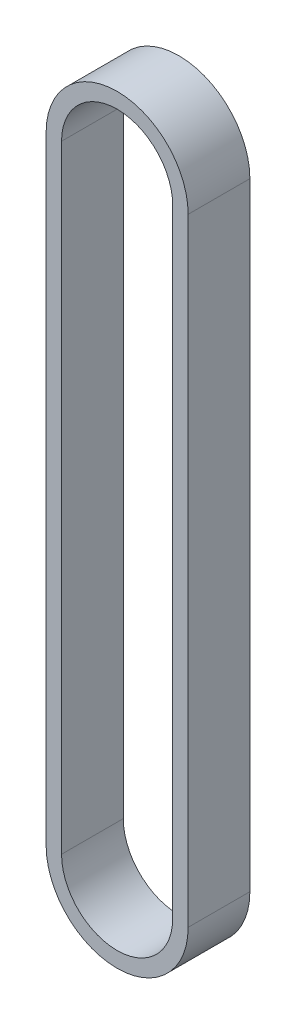
ISO-10303-21;
HEADER;
FILE_DESCRIPTION(('STEP AP214'),'2;1');
FILE_NAME('part.step','',(''),(''),'','','');
FILE_SCHEMA(('AUTOMOTIVE_DESIGN { 1 0 10303 214 1 1 1 1 }'));
ENDSEC;
DATA;
#1=APPLICATION_CONTEXT('core data for automotive mechanical design processes');
#2=APPLICATION_PROTOCOL_DEFINITION('international standard','automotive_design',2000,#1);
#3=PRODUCT_CONTEXT('',#1,'mechanical');
#4=PRODUCT('Part','Part','',(#3));
#5=PRODUCT_RELATED_PRODUCT_CATEGORY('part','',(#4));
#6=PRODUCT_DEFINITION_FORMATION('','',#4);
#7=PRODUCT_DEFINITION_CONTEXT('part definition',#1,'design');
#8=PRODUCT_DEFINITION('design','',#6,#7);
#9=PRODUCT_DEFINITION_SHAPE('','',#8);
#10=(LENGTH_UNIT() NAMED_UNIT(*) SI_UNIT(.MILLI.,.METRE.));
#11=(NAMED_UNIT(*) PLANE_ANGLE_UNIT() SI_UNIT($,.RADIAN.));
#12=(NAMED_UNIT(*) SI_UNIT($,.STERADIAN.) SOLID_ANGLE_UNIT());
#13=UNCERTAINTY_MEASURE_WITH_UNIT(LENGTH_MEASURE(1.E-05),#10,'distance_accuracy_value','');
#14=(GEOMETRIC_REPRESENTATION_CONTEXT(3) GLOBAL_UNCERTAINTY_ASSIGNED_CONTEXT((#13)) GLOBAL_UNIT_ASSIGNED_CONTEXT((#10,
#11,#12)) REPRESENTATION_CONTEXT('',''));
#15=CARTESIAN_POINT('',(0.,0.,0.));
#16=DIRECTION('',(0.,0.,1.));
#17=DIRECTION('',(1.,0.,0.));
#18=AXIS2_PLACEMENT_3D('',#15,#16,#17);
#19=CARTESIAN_POINT('',(0.,30.,3.));
#20=DIRECTION('',(0.,0.,1.));
#21=DIRECTION('',(1.,0.,0.));
#22=AXIS2_PLACEMENT_3D('',#19,#20,#21);
#23=PLANE('',#22);
#24=CARTESIAN_POINT('',(0.,30.,3.));
#25=DIRECTION('',(0.,0.,1.));
#26=DIRECTION('',(1.,0.,0.));
#27=AXIS2_PLACEMENT_3D('',#24,#25,#26);
#28=CIRCLE('',#27,6.9);
#29=CARTESIAN_POINT('',(6.9,30.,3.));
#30=VERTEX_POINT('',#29);
#31=CARTESIAN_POINT('',(-6.9,30.,3.));
#32=VERTEX_POINT('',#31);
#33=EDGE_CURVE('E118',#30,#32,#28,.T.);
#34=ORIENTED_EDGE('',*,*,#33,.T.);
#35=DIRECTION('',(0.,-1.,0.));
#36=VECTOR('',#35,1.);
#37=CARTESIAN_POINT('',(-6.9,30.,3.));
#38=LINE('',#37,#36);
#39=CARTESIAN_POINT('',(-6.9,-30.,3.));
#40=VERTEX_POINT('',#39);
#41=EDGE_CURVE('E121',#32,#40,#38,.T.);
#42=ORIENTED_EDGE('',*,*,#41,.T.);
#43=CARTESIAN_POINT('',(0.,-30.,3.));
#44=DIRECTION('',(0.,0.,1.));
#45=DIRECTION('',(1.,0.,0.));
#46=AXIS2_PLACEMENT_3D('',#43,#44,#45);
#47=CIRCLE('',#46,6.9);
#48=CARTESIAN_POINT('',(6.9,-30.,3.));
#49=VERTEX_POINT('',#48);
#50=EDGE_CURVE('E124',#40,#49,#47,.T.);
#51=ORIENTED_EDGE('',*,*,#50,.T.);
#52=DIRECTION('',(0.,1.,0.));
#53=VECTOR('',#52,1.);
#54=CARTESIAN_POINT('',(6.9,30.,3.));
#55=LINE('',#54,#53);
#56=EDGE_CURVE('E126',#49,#30,#55,.T.);
#57=ORIENTED_EDGE('',*,*,#56,.T.);
#58=EDGE_LOOP('',(#34,#42,#51,#57));
#59=FACE_BOUND('',#58,.T.);
#60=DIRECTION('',(0.,-1.,0.));
#61=VECTOR('',#60,1.);
#62=CARTESIAN_POINT('',(-5.4,30.,3.));
#63=LINE('',#62,#61);
#64=CARTESIAN_POINT('',(-5.4,30.,3.));
#65=VERTEX_POINT('',#64);
#66=CARTESIAN_POINT('',(-5.4,-30.,3.));
#67=VERTEX_POINT('',#66);
#68=EDGE_CURVE('E90',#65,#67,#63,.T.);
#69=ORIENTED_EDGE('',*,*,#68,.F.);
#70=CARTESIAN_POINT('',(0.,30.,3.));
#71=DIRECTION('',(0.,0.,1.));
#72=DIRECTION('',(1.,0.,0.));
#73=AXIS2_PLACEMENT_3D('',#70,#71,#72);
#74=CIRCLE('',#73,5.4);
#75=CARTESIAN_POINT('',(5.4,30.,3.));
#76=VERTEX_POINT('',#75);
#77=EDGE_CURVE('E82',#76,#65,#74,.T.);
#78=ORIENTED_EDGE('',*,*,#77,.F.);
#79=DIRECTION('',(0.,1.,0.));
#80=VECTOR('',#79,1.);
#81=CARTESIAN_POINT('',(5.4,30.,3.));
#82=LINE('',#81,#80);
#83=CARTESIAN_POINT('',(5.4,-30.,3.));
#84=VERTEX_POINT('',#83);
#85=EDGE_CURVE('E104',#84,#76,#82,.T.);
#86=ORIENTED_EDGE('',*,*,#85,.F.);
#87=CARTESIAN_POINT('',(0.,-30.,3.));
#88=DIRECTION('',(0.,0.,1.));
#89=DIRECTION('',(1.,0.,0.));
#90=AXIS2_PLACEMENT_3D('',#87,#88,#89);
#91=CIRCLE('',#90,5.4);
#92=EDGE_CURVE('E102',#67,#84,#91,.T.);
#93=ORIENTED_EDGE('',*,*,#92,.F.);
#94=EDGE_LOOP('',(#69,#78,#86,#93));
#95=FACE_BOUND('',#94,.T.);
#96=ADVANCED_FACE('F17',(#59,#95),#23,.T.);
#97=CARTESIAN_POINT('',(0.,30.,-3.));
#98=DIRECTION('',(0.,0.,1.));
#99=DIRECTION('',(1.,0.,0.));
#100=AXIS2_PLACEMENT_3D('',#97,#98,#99);
#101=PLANE('',#100);
#102=CARTESIAN_POINT('',(0.,30.,-3.));
#103=DIRECTION('',(0.,0.,1.));
#104=DIRECTION('',(1.,0.,0.));
#105=AXIS2_PLACEMENT_3D('',#102,#103,#104);
#106=CIRCLE('',#105,6.9);
#107=CARTESIAN_POINT('',(6.9,30.,-3.));
#108=VERTEX_POINT('',#107);
#109=CARTESIAN_POINT('',(-6.9,30.,-3.));
#110=VERTEX_POINT('',#109);
#111=EDGE_CURVE('E98',#108,#110,#106,.T.);
#112=ORIENTED_EDGE('',*,*,#111,.F.);
#113=DIRECTION('',(0.,1.,0.));
#114=VECTOR('',#113,1.);
#115=CARTESIAN_POINT('',(6.9,30.,-3.));
#116=LINE('',#115,#114);
#117=CARTESIAN_POINT('',(6.9,-30.,-3.));
#118=VERTEX_POINT('',#117);
#119=EDGE_CURVE('E122',#118,#108,#116,.T.);
#120=ORIENTED_EDGE('',*,*,#119,.F.);
#121=CARTESIAN_POINT('',(0.,-30.,-3.));
#122=DIRECTION('',(0.,0.,1.));
#123=DIRECTION('',(1.,0.,0.));
#124=AXIS2_PLACEMENT_3D('',#121,#122,#123);
#125=CIRCLE('',#124,6.9);
#126=CARTESIAN_POINT('',(-6.9,-30.,-3.));
#127=VERTEX_POINT('',#126);
#128=EDGE_CURVE('E133',#127,#118,#125,.T.);
#129=ORIENTED_EDGE('',*,*,#128,.F.);
#130=DIRECTION('',(0.,-1.,0.));
#131=VECTOR('',#130,1.);
#132=CARTESIAN_POINT('',(-6.9,30.,-3.));
#133=LINE('',#132,#131);
#134=EDGE_CURVE('E131',#110,#127,#133,.T.);
#135=ORIENTED_EDGE('',*,*,#134,.F.);
#136=EDGE_LOOP('',(#112,#120,#129,#135));
#137=FACE_BOUND('',#136,.T.);
#138=CARTESIAN_POINT('',(0.,30.,-3.));
#139=DIRECTION('',(0.,0.,1.));
#140=DIRECTION('',(1.,0.,0.));
#141=AXIS2_PLACEMENT_3D('',#138,#139,#140);
#142=CIRCLE('',#141,5.4);
#143=CARTESIAN_POINT('',(5.4,30.,-3.));
#144=VERTEX_POINT('',#143);
#145=CARTESIAN_POINT('',(-5.4,30.,-3.));
#146=VERTEX_POINT('',#145);
#147=EDGE_CURVE('E40',#144,#146,#142,.T.);
#148=ORIENTED_EDGE('',*,*,#147,.T.);
#149=DIRECTION('',(0.,-1.,0.));
#150=VECTOR('',#149,1.);
#151=CARTESIAN_POINT('',(-5.4,30.,-3.));
#152=LINE('',#151,#150);
#153=CARTESIAN_POINT('',(-5.4,-30.,-3.));
#154=VERTEX_POINT('',#153);
#155=EDGE_CURVE('E97',#146,#154,#152,.T.);
#156=ORIENTED_EDGE('',*,*,#155,.T.);
#157=CARTESIAN_POINT('',(0.,-30.,-3.));
#158=DIRECTION('',(0.,0.,1.));
#159=DIRECTION('',(1.,0.,0.));
#160=AXIS2_PLACEMENT_3D('',#157,#158,#159);
#161=CIRCLE('',#160,5.4);
#162=CARTESIAN_POINT('',(5.4,-30.,-3.));
#163=VERTEX_POINT('',#162);
#164=EDGE_CURVE('E110',#154,#163,#161,.T.);
#165=ORIENTED_EDGE('',*,*,#164,.T.);
#166=DIRECTION('',(0.,1.,0.));
#167=VECTOR('',#166,1.);
#168=CARTESIAN_POINT('',(5.4,30.,-3.));
#169=LINE('',#168,#167);
#170=EDGE_CURVE('E91',#163,#144,#169,.T.);
#171=ORIENTED_EDGE('',*,*,#170,.T.);
#172=EDGE_LOOP('',(#148,#156,#165,#171));
#173=FACE_BOUND('',#172,.T.);
#174=ADVANCED_FACE('F151',(#137,#173),#101,.F.);
#175=CARTESIAN_POINT('',(0.,30.,3.));
#176=DIRECTION('',(0.,0.,-1.));
#177=DIRECTION('',(-1.,0.,0.));
#178=AXIS2_PLACEMENT_3D('',#175,#176,#177);
#179=CYLINDRICAL_SURFACE('',#178,6.9);
#180=ORIENTED_EDGE('',*,*,#111,.T.);
#181=DIRECTION('',(0.,0.,-1.));
#182=VECTOR('',#181,1.);
#183=CARTESIAN_POINT('',(-6.9,30.,3.));
#184=LINE('',#183,#182);
#185=EDGE_CURVE('E11',#32,#110,#184,.T.);
#186=ORIENTED_EDGE('',*,*,#185,.F.);
#187=ORIENTED_EDGE('',*,*,#33,.F.);
#188=DIRECTION('',(0.,0.,-1.));
#189=VECTOR('',#188,1.);
#190=CARTESIAN_POINT('',(6.9,30.,3.));
#191=LINE('',#190,#189);
#192=EDGE_CURVE('E128',#30,#108,#191,.T.);
#193=ORIENTED_EDGE('',*,*,#192,.T.);
#194=EDGE_LOOP('',(#180,#186,#187,#193));
#195=FACE_BOUND('',#194,.T.);
#196=ADVANCED_FACE('F19',(#195),#179,.T.);
#197=CARTESIAN_POINT('',(-6.9,30.,3.));
#198=DIRECTION('',(1.,0.,0.));
#199=DIRECTION('',(0.,1.,0.));
#200=AXIS2_PLACEMENT_3D('',#197,#198,#199);
#201=PLANE('',#200);
#202=ORIENTED_EDGE('',*,*,#134,.T.);
#203=DIRECTION('',(0.,0.,-1.));
#204=VECTOR('',#203,1.);
#205=CARTESIAN_POINT('',(-6.9,-30.,3.));
#206=LINE('',#205,#204);
#207=EDGE_CURVE('E25',#40,#127,#206,.T.);
#208=ORIENTED_EDGE('',*,*,#207,.F.);
#209=ORIENTED_EDGE('',*,*,#41,.F.);
#210=ORIENTED_EDGE('',*,*,#185,.T.);
#211=EDGE_LOOP('',(#202,#208,#209,#210));
#212=FACE_BOUND('',#211,.T.);
#213=ADVANCED_FACE('F161',(#212),#201,.F.);
#214=CARTESIAN_POINT('',(0.,-30.,3.));
#215=DIRECTION('',(0.,0.,-1.));
#216=DIRECTION('',(-1.,0.,0.));
#217=AXIS2_PLACEMENT_3D('',#214,#215,#216);
#218=CYLINDRICAL_SURFACE('',#217,6.9);
#219=ORIENTED_EDGE('',*,*,#128,.T.);
#220=DIRECTION('',(0.,0.,-1.));
#221=VECTOR('',#220,1.);
#222=CARTESIAN_POINT('',(6.9,-30.,3.));
#223=LINE('',#222,#221);
#224=EDGE_CURVE('E138',#49,#118,#223,.T.);
#225=ORIENTED_EDGE('',*,*,#224,.F.);
#226=ORIENTED_EDGE('',*,*,#50,.F.);
#227=ORIENTED_EDGE('',*,*,#207,.T.);
#228=EDGE_LOOP('',(#219,#225,#226,#227));
#229=FACE_BOUND('',#228,.T.);
#230=ADVANCED_FACE('F145',(#229),#218,.T.);
#231=CARTESIAN_POINT('',(6.9,30.,3.));
#232=DIRECTION('',(-1.,0.,0.));
#233=DIRECTION('',(0.,-1.,0.));
#234=AXIS2_PLACEMENT_3D('',#231,#232,#233);
#235=PLANE('',#234);
#236=ORIENTED_EDGE('',*,*,#119,.T.);
#237=ORIENTED_EDGE('',*,*,#192,.F.);
#238=ORIENTED_EDGE('',*,*,#56,.F.);
#239=ORIENTED_EDGE('',*,*,#224,.T.);
#240=EDGE_LOOP('',(#236,#237,#238,#239));
#241=FACE_BOUND('',#240,.T.);
#242=ADVANCED_FACE('F155',(#241),#235,.F.);
#243=CARTESIAN_POINT('',(0.,30.,3.));
#244=DIRECTION('',(0.,0.,-1.));
#245=DIRECTION('',(-1.,0.,0.));
#246=AXIS2_PLACEMENT_3D('',#243,#244,#245);
#247=CYLINDRICAL_SURFACE('',#246,5.4);
#248=ORIENTED_EDGE('',*,*,#147,.F.);
#249=DIRECTION('',(0.,0.,-1.));
#250=VECTOR('',#249,1.);
#251=CARTESIAN_POINT('',(5.4,30.,3.));
#252=LINE('',#251,#250);
#253=EDGE_CURVE('E86',#76,#144,#252,.T.);
#254=ORIENTED_EDGE('',*,*,#253,.F.);
#255=ORIENTED_EDGE('',*,*,#77,.T.);
#256=DIRECTION('',(0.,0.,-1.));
#257=VECTOR('',#256,1.);
#258=CARTESIAN_POINT('',(-5.4,30.,3.));
#259=LINE('',#258,#257);
#260=EDGE_CURVE('E85',#65,#146,#259,.T.);
#261=ORIENTED_EDGE('',*,*,#260,.T.);
#262=EDGE_LOOP('',(#248,#254,#255,#261));
#263=FACE_BOUND('',#262,.T.);
#264=ADVANCED_FACE('F84',(#263),#247,.F.);
#265=CARTESIAN_POINT('',(-5.4,30.,3.));
#266=DIRECTION('',(1.,0.,0.));
#267=DIRECTION('',(0.,1.,0.));
#268=AXIS2_PLACEMENT_3D('',#265,#266,#267);
#269=PLANE('',#268);
#270=ORIENTED_EDGE('',*,*,#155,.F.);
#271=ORIENTED_EDGE('',*,*,#260,.F.);
#272=ORIENTED_EDGE('',*,*,#68,.T.);
#273=DIRECTION('',(0.,0.,-1.));
#274=VECTOR('',#273,1.);
#275=CARTESIAN_POINT('',(-5.4,-30.,3.));
#276=LINE('',#275,#274);
#277=EDGE_CURVE('E99',#67,#154,#276,.T.);
#278=ORIENTED_EDGE('',*,*,#277,.T.);
#279=EDGE_LOOP('',(#270,#271,#272,#278));
#280=FACE_BOUND('',#279,.T.);
#281=ADVANCED_FACE('F94',(#280),#269,.T.);
#282=CARTESIAN_POINT('',(0.,-30.,3.));
#283=DIRECTION('',(0.,0.,-1.));
#284=DIRECTION('',(-1.,0.,0.));
#285=AXIS2_PLACEMENT_3D('',#282,#283,#284);
#286=CYLINDRICAL_SURFACE('',#285,5.4);
#287=ORIENTED_EDGE('',*,*,#164,.F.);
#288=ORIENTED_EDGE('',*,*,#277,.F.);
#289=ORIENTED_EDGE('',*,*,#92,.T.);
#290=DIRECTION('',(0.,0.,-1.));
#291=VECTOR('',#290,1.);
#292=CARTESIAN_POINT('',(5.4,-30.,3.));
#293=LINE('',#292,#291);
#294=EDGE_CURVE('E32',#84,#163,#293,.T.);
#295=ORIENTED_EDGE('',*,*,#294,.T.);
#296=EDGE_LOOP('',(#287,#288,#289,#295));
#297=FACE_BOUND('',#296,.T.);
#298=ADVANCED_FACE('F189',(#297),#286,.F.);
#299=CARTESIAN_POINT('',(5.4,30.,3.));
#300=DIRECTION('',(-1.,0.,0.));
#301=DIRECTION('',(0.,-1.,0.));
#302=AXIS2_PLACEMENT_3D('',#299,#300,#301);
#303=PLANE('',#302);
#304=ORIENTED_EDGE('',*,*,#170,.F.);
#305=ORIENTED_EDGE('',*,*,#294,.F.);
#306=ORIENTED_EDGE('',*,*,#85,.T.);
#307=ORIENTED_EDGE('',*,*,#253,.T.);
#308=EDGE_LOOP('',(#304,#305,#306,#307));
#309=FACE_BOUND('',#308,.T.);
#310=ADVANCED_FACE('F194',(#309),#303,.T.);
#311=CLOSED_SHELL('',(#96,#174,#196,#213,#230,#242,#264,#281,#298,#310));
#312=MANIFOLD_SOLID_BREP('B1',#311);
#313=ADVANCED_BREP_SHAPE_REPRESENTATION('',(#18,#312),#14);
#314=SHAPE_DEFINITION_REPRESENTATION(#9,#313);
ENDSEC;
END-ISO-10303-21;
